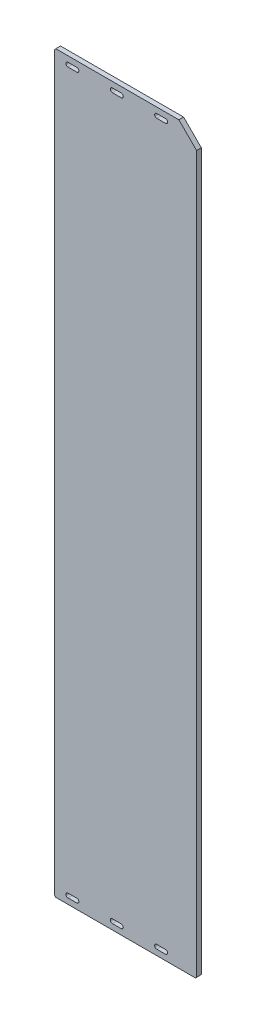
ISO-10303-21;
HEADER;
FILE_DESCRIPTION(('STEP AP214'),'2;1');
FILE_NAME('part.step','',(''),(''),'','','');
FILE_SCHEMA(('AUTOMOTIVE_DESIGN { 1 0 10303 214 1 1 1 1 }'));
ENDSEC;
DATA;
#1=APPLICATION_CONTEXT('core data for automotive mechanical design processes');
#2=APPLICATION_PROTOCOL_DEFINITION('international standard','automotive_design',2000,#1);
#3=PRODUCT_CONTEXT('',#1,'mechanical');
#4=PRODUCT('Part','Part','',(#3));
#5=PRODUCT_RELATED_PRODUCT_CATEGORY('part','',(#4));
#6=PRODUCT_DEFINITION_FORMATION('','',#4);
#7=PRODUCT_DEFINITION_CONTEXT('part definition',#1,'design');
#8=PRODUCT_DEFINITION('design','',#6,#7);
#9=PRODUCT_DEFINITION_SHAPE('','',#8);
#10=(LENGTH_UNIT() NAMED_UNIT(*) SI_UNIT(.MILLI.,.METRE.));
#11=(NAMED_UNIT(*) PLANE_ANGLE_UNIT() SI_UNIT($,.RADIAN.));
#12=(NAMED_UNIT(*) SI_UNIT($,.STERADIAN.) SOLID_ANGLE_UNIT());
#13=UNCERTAINTY_MEASURE_WITH_UNIT(LENGTH_MEASURE(1.E-05),#10,'distance_accuracy_value','');
#14=(GEOMETRIC_REPRESENTATION_CONTEXT(3) GLOBAL_UNCERTAINTY_ASSIGNED_CONTEXT((#13)) GLOBAL_UNIT_ASSIGNED_CONTEXT((#10,
#11,#12)) REPRESENTATION_CONTEXT('',''));
#15=CARTESIAN_POINT('',(0.,0.,0.));
#16=DIRECTION('',(0.,0.,1.));
#17=DIRECTION('',(1.,0.,0.));
#18=AXIS2_PLACEMENT_3D('',#15,#16,#17);
#19=CARTESIAN_POINT('',(120.,-621.,8.));
#20=DIRECTION('',(-1.,0.,0.));
#21=DIRECTION('',(0.,0.,1.));
#22=AXIS2_PLACEMENT_3D('',#19,#20,#21);
#23=PLANE('',#22);
#24=DIRECTION('',(0.,1.,0.));
#25=VECTOR('',#24,1.);
#26=CARTESIAN_POINT('',(120.,-621.,8.));
#27=LINE('',#26,#25);
#28=CARTESIAN_POINT('',(120.,-619.,8.));
#29=VERTEX_POINT('',#28);
#30=CARTESIAN_POINT('',(120.,591.,8.));
#31=VERTEX_POINT('',#30);
#32=EDGE_CURVE('E441',#29,#31,#27,.T.);
#33=ORIENTED_EDGE('',*,*,#32,.F.);
#34=DIRECTION('',(0.,0.,-1.));
#35=VECTOR('',#34,1.);
#36=CARTESIAN_POINT('',(120.,-619.,8.));
#37=LINE('',#36,#35);
#38=CARTESIAN_POINT('',(120.,-619.,0.));
#39=VERTEX_POINT('',#38);
#40=EDGE_CURVE('E473',#29,#39,#37,.T.);
#41=ORIENTED_EDGE('',*,*,#40,.T.);
#42=DIRECTION('',(0.,1.,0.));
#43=VECTOR('',#42,1.);
#44=CARTESIAN_POINT('',(120.,-621.,0.));
#45=LINE('',#44,#43);
#46=CARTESIAN_POINT('',(120.,591.,0.));
#47=VERTEX_POINT('',#46);
#48=EDGE_CURVE('E440',#39,#47,#45,.T.);
#49=ORIENTED_EDGE('',*,*,#48,.T.);
#50=DIRECTION('',(0.,0.,1.));
#51=VECTOR('',#50,1.);
#52=CARTESIAN_POINT('',(120.,591.,8.));
#53=LINE('',#52,#51);
#54=EDGE_CURVE('E468',#47,#31,#53,.T.);
#55=ORIENTED_EDGE('',*,*,#54,.T.);
#56=EDGE_LOOP('',(#33,#41,#49,#55));
#57=FACE_BOUND('',#56,.T.);
#58=ADVANCED_FACE('F34',(#57),#23,.F.);
#59=CARTESIAN_POINT('',(-120.,621.,8.));
#60=DIRECTION('',(0.,-1.,0.));
#61=DIRECTION('',(0.,0.,-1.));
#62=AXIS2_PLACEMENT_3D('',#59,#60,#61);
#63=PLANE('',#62);
#64=DIRECTION('',(-1.,0.,0.));
#65=VECTOR('',#64,1.);
#66=CARTESIAN_POINT('',(-120.,621.,0.));
#67=LINE('',#66,#65);
#68=CARTESIAN_POINT('',(89.9999999999998,621.,0.));
#69=VERTEX_POINT('',#68);
#70=CARTESIAN_POINT('',(-118.,621.,0.));
#71=VERTEX_POINT('',#70);
#72=EDGE_CURVE('E455',#69,#71,#67,.T.);
#73=ORIENTED_EDGE('',*,*,#72,.T.);
#74=DIRECTION('',(0.,0.,1.));
#75=VECTOR('',#74,1.);
#76=CARTESIAN_POINT('',(-118.,621.,8.));
#77=LINE('',#76,#75);
#78=CARTESIAN_POINT('',(-118.,621.,8.));
#79=VERTEX_POINT('',#78);
#80=EDGE_CURVE('E11',#71,#79,#77,.T.);
#81=ORIENTED_EDGE('',*,*,#80,.T.);
#82=DIRECTION('',(-1.,0.,0.));
#83=VECTOR('',#82,1.);
#84=CARTESIAN_POINT('',(-120.,621.,8.));
#85=LINE('',#84,#83);
#86=CARTESIAN_POINT('',(89.9999999999998,621.,8.));
#87=VERTEX_POINT('',#86);
#88=EDGE_CURVE('E443',#87,#79,#85,.T.);
#89=ORIENTED_EDGE('',*,*,#88,.F.);
#90=DIRECTION('',(0.,0.,-1.));
#91=VECTOR('',#90,1.);
#92=CARTESIAN_POINT('',(89.9999999999998,621.,8.));
#93=LINE('',#92,#91);
#94=EDGE_CURVE('E453',#87,#69,#93,.T.);
#95=ORIENTED_EDGE('',*,*,#94,.T.);
#96=EDGE_LOOP('',(#73,#81,#89,#95));
#97=FACE_BOUND('',#96,.T.);
#98=ADVANCED_FACE('F527',(#97),#63,.F.);
#99=CARTESIAN_POINT('',(-120.,-621.,8.));
#100=DIRECTION('',(1.,0.,0.));
#101=DIRECTION('',(0.,0.,-1.));
#102=AXIS2_PLACEMENT_3D('',#99,#100,#101);
#103=PLANE('',#102);
#104=DIRECTION('',(0.,-1.,0.));
#105=VECTOR('',#104,1.);
#106=CARTESIAN_POINT('',(-120.,-621.,0.));
#107=LINE('',#106,#105);
#108=CARTESIAN_POINT('',(-120.,619.,0.));
#109=VERTEX_POINT('',#108);
#110=CARTESIAN_POINT('',(-120.,-619.,0.));
#111=VERTEX_POINT('',#110);
#112=EDGE_CURVE('E458',#109,#111,#107,.T.);
#113=ORIENTED_EDGE('',*,*,#112,.T.);
#114=DIRECTION('',(0.,0.,1.));
#115=VECTOR('',#114,1.);
#116=CARTESIAN_POINT('',(-120.,-619.,8.));
#117=LINE('',#116,#115);
#118=CARTESIAN_POINT('',(-120.,-619.,8.));
#119=VERTEX_POINT('',#118);
#120=EDGE_CURVE('E42',#111,#119,#117,.T.);
#121=ORIENTED_EDGE('',*,*,#120,.T.);
#122=DIRECTION('',(0.,-1.,0.));
#123=VECTOR('',#122,1.);
#124=CARTESIAN_POINT('',(-120.,-621.,8.));
#125=LINE('',#124,#123);
#126=CARTESIAN_POINT('',(-120.,619.,8.));
#127=VERTEX_POINT('',#126);
#128=EDGE_CURVE('E447',#127,#119,#125,.T.);
#129=ORIENTED_EDGE('',*,*,#128,.F.);
#130=DIRECTION('',(0.,0.,-1.));
#131=VECTOR('',#130,1.);
#132=CARTESIAN_POINT('',(-120.,619.,8.));
#133=LINE('',#132,#131);
#134=EDGE_CURVE('E493',#127,#109,#133,.T.);
#135=ORIENTED_EDGE('',*,*,#134,.T.);
#136=EDGE_LOOP('',(#113,#121,#129,#135));
#137=FACE_BOUND('',#136,.T.);
#138=ADVANCED_FACE('F498',(#137),#103,.F.);
#139=CARTESIAN_POINT('',(-120.,-621.,8.));
#140=DIRECTION('',(0.,1.,0.));
#141=DIRECTION('',(0.,0.,1.));
#142=AXIS2_PLACEMENT_3D('',#139,#140,#141);
#143=PLANE('',#142);
#144=DIRECTION('',(1.,0.,0.));
#145=VECTOR('',#144,1.);
#146=CARTESIAN_POINT('',(-120.,-621.,0.));
#147=LINE('',#146,#145);
#148=CARTESIAN_POINT('',(-118.,-621.,0.));
#149=VERTEX_POINT('',#148);
#150=CARTESIAN_POINT('',(118.,-621.,0.));
#151=VERTEX_POINT('',#150);
#152=EDGE_CURVE('E444',#149,#151,#147,.T.);
#153=ORIENTED_EDGE('',*,*,#152,.T.);
#154=DIRECTION('',(0.,0.,1.));
#155=VECTOR('',#154,1.);
#156=CARTESIAN_POINT('',(118.,-621.,8.));
#157=LINE('',#156,#155);
#158=CARTESIAN_POINT('',(118.,-621.,8.));
#159=VERTEX_POINT('',#158);
#160=EDGE_CURVE('E485',#151,#159,#157,.T.);
#161=ORIENTED_EDGE('',*,*,#160,.T.);
#162=DIRECTION('',(1.,0.,0.));
#163=VECTOR('',#162,1.);
#164=CARTESIAN_POINT('',(-120.,-621.,8.));
#165=LINE('',#164,#163);
#166=CARTESIAN_POINT('',(-118.,-621.,8.));
#167=VERTEX_POINT('',#166);
#168=EDGE_CURVE('E450',#167,#159,#165,.T.);
#169=ORIENTED_EDGE('',*,*,#168,.F.);
#170=DIRECTION('',(0.,0.,-1.));
#171=VECTOR('',#170,1.);
#172=CARTESIAN_POINT('',(-118.,-621.,8.));
#173=LINE('',#172,#171);
#174=EDGE_CURVE('E482',#167,#149,#173,.T.);
#175=ORIENTED_EDGE('',*,*,#174,.T.);
#176=EDGE_LOOP('',(#153,#161,#169,#175));
#177=FACE_BOUND('',#176,.T.);
#178=ADVANCED_FACE('F511',(#177),#143,.F.);
#179=CARTESIAN_POINT('',(0.,0.,8.));
#180=DIRECTION('',(0.,0.,-1.));
#181=DIRECTION('',(-1.,0.,0.));
#182=AXIS2_PLACEMENT_3D('',#179,#180,#181);
#183=PLANE('',#182);
#184=DIRECTION('',(1.,0.,0.));
#185=VECTOR('',#184,1.);
#186=CARTESIAN_POINT('',(0.,611.500000000123,8.));
#187=LINE('',#186,#185);
#188=CARTESIAN_POINT('',(-22.5000000000772,611.500000000123,8.));
#189=VERTEX_POINT('',#188);
#190=CARTESIAN_POINT('',(-7.5000000000772,611.500000000123,8.));
#191=VERTEX_POINT('',#190);
#192=EDGE_CURVE('E402',#189,#191,#187,.T.);
#193=ORIENTED_EDGE('',*,*,#192,.T.);
#194=CARTESIAN_POINT('',(-7.5000000000772,608.000000000123,8.));
#195=DIRECTION('',(0.,0.,-1.));
#196=DIRECTION('',(-1.,0.,0.));
#197=AXIS2_PLACEMENT_3D('',#194,#195,#196);
#198=CIRCLE('',#197,3.50000000000006);
#199=CARTESIAN_POINT('',(-7.5000000000772,604.500000000123,8.));
#200=VERTEX_POINT('',#199);
#201=EDGE_CURVE('E405',#191,#200,#198,.T.);
#202=ORIENTED_EDGE('',*,*,#201,.T.);
#203=DIRECTION('',(-1.,0.,0.));
#204=VECTOR('',#203,1.);
#205=CARTESIAN_POINT('',(0.,604.500000000123,8.));
#206=LINE('',#205,#204);
#207=CARTESIAN_POINT('',(-22.5000000000772,604.500000000123,8.));
#208=VERTEX_POINT('',#207);
#209=EDGE_CURVE('E399',#200,#208,#206,.T.);
#210=ORIENTED_EDGE('',*,*,#209,.T.);
#211=CARTESIAN_POINT('',(-22.5000000000772,608.000000000123,8.));
#212=DIRECTION('',(0.,0.,-1.));
#213=DIRECTION('',(-1.,0.,0.));
#214=AXIS2_PLACEMENT_3D('',#211,#212,#213);
#215=CIRCLE('',#214,3.50000000000006);
#216=EDGE_CURVE('E247',#208,#189,#215,.T.);
#217=ORIENTED_EDGE('',*,*,#216,.T.);
#218=EDGE_LOOP('',(#193,#202,#210,#217));
#219=FACE_BOUND('',#218,.T.);
#220=DIRECTION('',(1.,0.,0.));
#221=VECTOR('',#220,1.);
#222=CARTESIAN_POINT('',(0.,611.500000000123,8.));
#223=LINE('',#222,#221);
#224=CARTESIAN_POINT('',(-97.5000000000772,611.500000000123,8.));
#225=VERTEX_POINT('',#224);
#226=CARTESIAN_POINT('',(-82.5000000000772,611.500000000123,8.));
#227=VERTEX_POINT('',#226);
#228=EDGE_CURVE('E393',#225,#227,#223,.T.);
#229=ORIENTED_EDGE('',*,*,#228,.T.);
#230=CARTESIAN_POINT('',(-82.5000000000772,608.000000000123,8.));
#231=DIRECTION('',(0.,0.,-1.));
#232=DIRECTION('',(-1.,0.,0.));
#233=AXIS2_PLACEMENT_3D('',#230,#231,#232);
#234=CIRCLE('',#233,3.50000000000006);
#235=CARTESIAN_POINT('',(-82.5000000000772,604.500000000123,8.));
#236=VERTEX_POINT('',#235);
#237=EDGE_CURVE('E396',#227,#236,#234,.T.);
#238=ORIENTED_EDGE('',*,*,#237,.T.);
#239=DIRECTION('',(-1.,0.,0.));
#240=VECTOR('',#239,1.);
#241=CARTESIAN_POINT('',(0.,604.500000000123,8.));
#242=LINE('',#241,#240);
#243=CARTESIAN_POINT('',(-97.5000000000772,604.500000000123,8.));
#244=VERTEX_POINT('',#243);
#245=EDGE_CURVE('E387',#236,#244,#242,.T.);
#246=ORIENTED_EDGE('',*,*,#245,.T.);
#247=CARTESIAN_POINT('',(-97.5000000000772,608.000000000123,8.));
#248=DIRECTION('',(0.,0.,-1.));
#249=DIRECTION('',(-1.,0.,0.));
#250=AXIS2_PLACEMENT_3D('',#247,#248,#249);
#251=CIRCLE('',#250,3.50000000000006);
#252=EDGE_CURVE('E390',#244,#225,#251,.T.);
#253=ORIENTED_EDGE('',*,*,#252,.T.);
#254=EDGE_LOOP('',(#229,#238,#246,#253));
#255=FACE_BOUND('',#254,.T.);
#256=DIRECTION('',(1.,0.,0.));
#257=VECTOR('',#256,1.);
#258=CARTESIAN_POINT('',(0.,-604.500000000123,8.));
#259=LINE('',#258,#257);
#260=CARTESIAN_POINT('',(52.4999999999228,-604.500000000123,8.));
#261=VERTEX_POINT('',#260);
#262=CARTESIAN_POINT('',(67.4999999999227,-604.500000000123,8.));
#263=VERTEX_POINT('',#262);
#264=EDGE_CURVE('E381',#261,#263,#259,.T.);
#265=ORIENTED_EDGE('',*,*,#264,.T.);
#266=CARTESIAN_POINT('',(67.4999999999227,-608.000000000123,8.));
#267=DIRECTION('',(0.,0.,-1.));
#268=DIRECTION('',(-1.,0.,0.));
#269=AXIS2_PLACEMENT_3D('',#266,#267,#268);
#270=CIRCLE('',#269,3.50000000000006);
#271=CARTESIAN_POINT('',(67.4999999999227,-611.500000000123,8.));
#272=VERTEX_POINT('',#271);
#273=EDGE_CURVE('E384',#263,#272,#270,.T.);
#274=ORIENTED_EDGE('',*,*,#273,.T.);
#275=DIRECTION('',(-1.,0.,0.));
#276=VECTOR('',#275,1.);
#277=CARTESIAN_POINT('',(0.,-611.500000000123,8.));
#278=LINE('',#277,#276);
#279=CARTESIAN_POINT('',(52.4999999999228,-611.500000000123,8.));
#280=VERTEX_POINT('',#279);
#281=EDGE_CURVE('E375',#272,#280,#278,.T.);
#282=ORIENTED_EDGE('',*,*,#281,.T.);
#283=CARTESIAN_POINT('',(52.4999999999228,-608.000000000123,8.));
#284=DIRECTION('',(0.,0.,-1.));
#285=DIRECTION('',(-1.,0.,0.));
#286=AXIS2_PLACEMENT_3D('',#283,#284,#285);
#287=CIRCLE('',#286,3.50000000000006);
#288=EDGE_CURVE('E378',#280,#261,#287,.T.);
#289=ORIENTED_EDGE('',*,*,#288,.T.);
#290=EDGE_LOOP('',(#265,#274,#282,#289));
#291=FACE_BOUND('',#290,.T.);
#292=DIRECTION('',(1.,0.,0.));
#293=VECTOR('',#292,1.);
#294=CARTESIAN_POINT('',(0.,-604.500000000123,8.));
#295=LINE('',#294,#293);
#296=CARTESIAN_POINT('',(-22.5000000000772,-604.500000000123,8.));
#297=VERTEX_POINT('',#296);
#298=CARTESIAN_POINT('',(-7.5000000000772,-604.500000000123,8.));
#299=VERTEX_POINT('',#298);
#300=EDGE_CURVE('E369',#297,#299,#295,.T.);
#301=ORIENTED_EDGE('',*,*,#300,.T.);
#302=CARTESIAN_POINT('',(-7.5000000000772,-608.000000000123,8.));
#303=DIRECTION('',(0.,0.,-1.));
#304=DIRECTION('',(-1.,0.,0.));
#305=AXIS2_PLACEMENT_3D('',#302,#303,#304);
#306=CIRCLE('',#305,3.50000000000006);
#307=CARTESIAN_POINT('',(-7.5000000000772,-611.500000000123,8.));
#308=VERTEX_POINT('',#307);
#309=EDGE_CURVE('E372',#299,#308,#306,.T.);
#310=ORIENTED_EDGE('',*,*,#309,.T.);
#311=DIRECTION('',(-1.,0.,0.));
#312=VECTOR('',#311,1.);
#313=CARTESIAN_POINT('',(0.,-611.500000000123,8.));
#314=LINE('',#313,#312);
#315=CARTESIAN_POINT('',(-22.5000000000772,-611.500000000123,8.));
#316=VERTEX_POINT('',#315);
#317=EDGE_CURVE('E363',#308,#316,#314,.T.);
#318=ORIENTED_EDGE('',*,*,#317,.T.);
#319=CARTESIAN_POINT('',(-22.5000000000772,-608.000000000123,8.));
#320=DIRECTION('',(0.,0.,-1.));
#321=DIRECTION('',(-1.,0.,0.));
#322=AXIS2_PLACEMENT_3D('',#319,#320,#321);
#323=CIRCLE('',#322,3.50000000000006);
#324=EDGE_CURVE('E366',#316,#297,#323,.T.);
#325=ORIENTED_EDGE('',*,*,#324,.T.);
#326=EDGE_LOOP('',(#301,#310,#318,#325));
#327=FACE_BOUND('',#326,.T.);
#328=DIRECTION('',(1.,0.,0.));
#329=VECTOR('',#328,1.);
#330=CARTESIAN_POINT('',(0.,-604.500000000123,8.));
#331=LINE('',#330,#329);
#332=CARTESIAN_POINT('',(-97.5000000000771,-604.500000000123,8.));
#333=VERTEX_POINT('',#332);
#334=CARTESIAN_POINT('',(-82.5000000000771,-604.500000000123,8.));
#335=VERTEX_POINT('',#334);
#336=EDGE_CURVE('E357',#333,#335,#331,.T.);
#337=ORIENTED_EDGE('',*,*,#336,.T.);
#338=CARTESIAN_POINT('',(-82.5000000000771,-608.000000000123,8.));
#339=DIRECTION('',(0.,0.,-1.));
#340=DIRECTION('',(-1.,0.,0.));
#341=AXIS2_PLACEMENT_3D('',#338,#339,#340);
#342=CIRCLE('',#341,3.50000000000006);
#343=CARTESIAN_POINT('',(-82.5000000000771,-611.500000000123,8.));
#344=VERTEX_POINT('',#343);
#345=EDGE_CURVE('E360',#335,#344,#342,.T.);
#346=ORIENTED_EDGE('',*,*,#345,.T.);
#347=DIRECTION('',(-1.,0.,0.));
#348=VECTOR('',#347,1.);
#349=CARTESIAN_POINT('',(0.,-611.500000000123,8.));
#350=LINE('',#349,#348);
#351=CARTESIAN_POINT('',(-97.5000000000771,-611.500000000123,8.));
#352=VERTEX_POINT('',#351);
#353=EDGE_CURVE('E271',#344,#352,#350,.T.);
#354=ORIENTED_EDGE('',*,*,#353,.T.);
#355=CARTESIAN_POINT('',(-97.5000000000771,-608.000000000123,8.));
#356=DIRECTION('',(0.,0.,-1.));
#357=DIRECTION('',(-1.,0.,0.));
#358=AXIS2_PLACEMENT_3D('',#355,#356,#357);
#359=CIRCLE('',#358,3.50000000000006);
#360=EDGE_CURVE('E354',#352,#333,#359,.T.);
#361=ORIENTED_EDGE('',*,*,#360,.T.);
#362=EDGE_LOOP('',(#337,#346,#354,#361));
#363=FACE_BOUND('',#362,.T.);
#364=DIRECTION('',(1.,0.,0.));
#365=VECTOR('',#364,1.);
#366=CARTESIAN_POINT('',(0.,611.500000000123,8.));
#367=LINE('',#366,#365);
#368=CARTESIAN_POINT('',(52.4999999999228,611.500000000123,8.));
#369=VERTEX_POINT('',#368);
#370=CARTESIAN_POINT('',(67.4999999999228,611.500000000123,8.));
#371=VERTEX_POINT('',#370);
#372=EDGE_CURVE('E434',#369,#371,#367,.T.);
#373=ORIENTED_EDGE('',*,*,#372,.T.);
#374=CARTESIAN_POINT('',(67.4999999999228,608.000000000123,8.));
#375=DIRECTION('',(0.,0.,-1.));
#376=DIRECTION('',(-1.,0.,0.));
#377=AXIS2_PLACEMENT_3D('',#374,#375,#376);
#378=CIRCLE('',#377,3.50000000000006);
#379=CARTESIAN_POINT('',(67.4999999999228,604.500000000123,8.));
#380=VERTEX_POINT('',#379);
#381=EDGE_CURVE('E437',#371,#380,#378,.T.);
#382=ORIENTED_EDGE('',*,*,#381,.T.);
#383=DIRECTION('',(-1.,0.,0.));
#384=VECTOR('',#383,1.);
#385=CARTESIAN_POINT('',(0.,604.500000000123,8.));
#386=LINE('',#385,#384);
#387=CARTESIAN_POINT('',(52.4999999999228,604.500000000123,8.));
#388=VERTEX_POINT('',#387);
#389=EDGE_CURVE('E422',#380,#388,#386,.T.);
#390=ORIENTED_EDGE('',*,*,#389,.T.);
#391=CARTESIAN_POINT('',(52.4999999999228,608.000000000123,8.));
#392=DIRECTION('',(0.,0.,-1.));
#393=DIRECTION('',(-1.,0.,0.));
#394=AXIS2_PLACEMENT_3D('',#391,#392,#393);
#395=CIRCLE('',#394,3.50000000000006);
#396=EDGE_CURVE('E431',#388,#369,#395,.T.);
#397=ORIENTED_EDGE('',*,*,#396,.T.);
#398=EDGE_LOOP('',(#373,#382,#390,#397));
#399=FACE_BOUND('',#398,.T.);
#400=ORIENTED_EDGE('',*,*,#168,.T.);
#401=DIRECTION('',(-0.707106781186567,-0.707106781186528,0.));
#402=VECTOR('',#401,1.);
#403=CARTESIAN_POINT('',(120.,-619.,8.));
#404=LINE('',#403,#402);
#405=EDGE_CURVE('E491',#159,#29,#404,.F.);
#406=ORIENTED_EDGE('',*,*,#405,.T.);
#407=ORIENTED_EDGE('',*,*,#32,.T.);
#408=DIRECTION('',(0.707106781186546,-0.707106781186549,0.));
#409=VECTOR('',#408,1.);
#410=CARTESIAN_POINT('',(89.9999999999998,621.,8.));
#411=LINE('',#410,#409);
#412=EDGE_CURVE('E471',#31,#87,#411,.F.);
#413=ORIENTED_EDGE('',*,*,#412,.T.);
#414=ORIENTED_EDGE('',*,*,#88,.T.);
#415=DIRECTION('',(0.707106781186587,0.707106781186508,0.));
#416=VECTOR('',#415,1.);
#417=CARTESIAN_POINT('',(-120.,619.,8.));
#418=LINE('',#417,#416);
#419=EDGE_CURVE('E487',#79,#127,#418,.F.);
#420=ORIENTED_EDGE('',*,*,#419,.T.);
#421=ORIENTED_EDGE('',*,*,#128,.T.);
#422=DIRECTION('',(-0.707106781186548,0.707106781186548,0.));
#423=VECTOR('',#422,1.);
#424=CARTESIAN_POINT('',(-118.,-621.,8.));
#425=LINE('',#424,#423);
#426=EDGE_CURVE('E489',#119,#167,#425,.F.);
#427=ORIENTED_EDGE('',*,*,#426,.T.);
#428=EDGE_LOOP('',(#400,#406,#407,#413,#414,#420,#421,#427));
#429=FACE_BOUND('',#428,.T.);
#430=ADVANCED_FACE('F504',(#219,#255,#291,#327,#363,#399,#429),#183,.F.);
#431=CARTESIAN_POINT('',(0.,0.,0.));
#432=DIRECTION('',(0.,0.,-1.));
#433=DIRECTION('',(-1.,0.,0.));
#434=AXIS2_PLACEMENT_3D('',#431,#432,#433);
#435=PLANE('',#434);
#436=CARTESIAN_POINT('',(-7.5000000000772,608.000000000123,0.));
#437=DIRECTION('',(0.,0.,-1.));
#438=DIRECTION('',(-1.,0.,0.));
#439=AXIS2_PLACEMENT_3D('',#436,#437,#438);
#440=CIRCLE('',#439,3.50000000000006);
#441=CARTESIAN_POINT('',(-7.5000000000772,611.500000000123,0.));
#442=VERTEX_POINT('',#441);
#443=CARTESIAN_POINT('',(-7.5000000000772,604.500000000123,0.));
#444=VERTEX_POINT('',#443);
#445=EDGE_CURVE('E259',#442,#444,#440,.T.);
#446=ORIENTED_EDGE('',*,*,#445,.F.);
#447=DIRECTION('',(1.,0.,0.));
#448=VECTOR('',#447,1.);
#449=CARTESIAN_POINT('',(-7.5000000000772,611.500000000123,0.));
#450=LINE('',#449,#448);
#451=CARTESIAN_POINT('',(-22.5000000000772,611.500000000123,0.));
#452=VERTEX_POINT('',#451);
#453=EDGE_CURVE('E264',#452,#442,#450,.T.);
#454=ORIENTED_EDGE('',*,*,#453,.F.);
#455=CARTESIAN_POINT('',(-22.5000000000772,608.000000000123,0.));
#456=DIRECTION('',(0.,0.,-1.));
#457=DIRECTION('',(-1.,0.,0.));
#458=AXIS2_PLACEMENT_3D('',#455,#456,#457);
#459=CIRCLE('',#458,3.50000000000006);
#460=CARTESIAN_POINT('',(-22.5000000000772,604.500000000123,0.));
#461=VERTEX_POINT('',#460);
#462=EDGE_CURVE('E244',#461,#452,#459,.T.);
#463=ORIENTED_EDGE('',*,*,#462,.F.);
#464=DIRECTION('',(-1.,0.,0.));
#465=VECTOR('',#464,1.);
#466=CARTESIAN_POINT('',(-7.5000000000772,604.500000000123,0.));
#467=LINE('',#466,#465);
#468=EDGE_CURVE('E254',#444,#461,#467,.T.);
#469=ORIENTED_EDGE('',*,*,#468,.F.);
#470=EDGE_LOOP('',(#446,#454,#463,#469));
#471=FACE_BOUND('',#470,.T.);
#472=CARTESIAN_POINT('',(-82.5000000000772,608.000000000123,0.));
#473=DIRECTION('',(0.,0.,-1.));
#474=DIRECTION('',(-1.,0.,0.));
#475=AXIS2_PLACEMENT_3D('',#472,#473,#474);
#476=CIRCLE('',#475,3.50000000000006);
#477=CARTESIAN_POINT('',(-82.5000000000772,611.500000000123,0.));
#478=VERTEX_POINT('',#477);
#479=CARTESIAN_POINT('',(-82.5000000000772,604.500000000123,0.));
#480=VERTEX_POINT('',#479);
#481=EDGE_CURVE('E274',#478,#480,#476,.T.);
#482=ORIENTED_EDGE('',*,*,#481,.F.);
#483=DIRECTION('',(1.,0.,0.));
#484=VECTOR('',#483,1.);
#485=CARTESIAN_POINT('',(-82.5000000000772,611.500000000123,0.));
#486=LINE('',#485,#484);
#487=CARTESIAN_POINT('',(-97.5000000000772,611.500000000123,0.));
#488=VERTEX_POINT('',#487);
#489=EDGE_CURVE('E282',#488,#478,#486,.T.);
#490=ORIENTED_EDGE('',*,*,#489,.F.);
#491=CARTESIAN_POINT('',(-97.5000000000772,608.000000000123,0.));
#492=DIRECTION('',(0.,0.,-1.));
#493=DIRECTION('',(-1.,0.,0.));
#494=AXIS2_PLACEMENT_3D('',#491,#492,#493);
#495=CIRCLE('',#494,3.50000000000006);
#496=CARTESIAN_POINT('',(-97.5000000000772,604.500000000123,0.));
#497=VERTEX_POINT('',#496);
#498=EDGE_CURVE('E279',#497,#488,#495,.T.);
#499=ORIENTED_EDGE('',*,*,#498,.F.);
#500=DIRECTION('',(-1.,0.,0.));
#501=VECTOR('',#500,1.);
#502=CARTESIAN_POINT('',(-82.5000000000772,604.500000000123,0.));
#503=LINE('',#502,#501);
#504=EDGE_CURVE('E276',#480,#497,#503,.T.);
#505=ORIENTED_EDGE('',*,*,#504,.F.);
#506=EDGE_LOOP('',(#482,#490,#499,#505));
#507=FACE_BOUND('',#506,.T.);
#508=CARTESIAN_POINT('',(67.4999999999227,-608.000000000123,0.));
#509=DIRECTION('',(0.,0.,-1.));
#510=DIRECTION('',(1.,0.,0.));
#511=AXIS2_PLACEMENT_3D('',#508,#509,#510);
#512=CIRCLE('',#511,3.50000000000006);
#513=CARTESIAN_POINT('',(67.4999999999227,-604.500000000123,0.));
#514=VERTEX_POINT('',#513);
#515=CARTESIAN_POINT('',(67.4999999999227,-611.500000000123,0.));
#516=VERTEX_POINT('',#515);
#517=EDGE_CURVE('E293',#514,#516,#512,.T.);
#518=ORIENTED_EDGE('',*,*,#517,.F.);
#519=DIRECTION('',(1.,0.,0.));
#520=VECTOR('',#519,1.);
#521=CARTESIAN_POINT('',(67.4999999999227,-604.500000000123,0.));
#522=LINE('',#521,#520);
#523=CARTESIAN_POINT('',(52.4999999999228,-604.500000000123,0.));
#524=VERTEX_POINT('',#523);
#525=EDGE_CURVE('E302',#524,#514,#522,.T.);
#526=ORIENTED_EDGE('',*,*,#525,.F.);
#527=CARTESIAN_POINT('',(52.4999999999228,-608.000000000123,0.));
#528=DIRECTION('',(0.,0.,-1.));
#529=DIRECTION('',(1.,0.,0.));
#530=AXIS2_PLACEMENT_3D('',#527,#528,#529);
#531=CIRCLE('',#530,3.50000000000006);
#532=CARTESIAN_POINT('',(52.4999999999228,-611.500000000123,0.));
#533=VERTEX_POINT('',#532);
#534=EDGE_CURVE('E299',#533,#524,#531,.T.);
#535=ORIENTED_EDGE('',*,*,#534,.F.);
#536=DIRECTION('',(-1.,0.,0.));
#537=VECTOR('',#536,1.);
#538=CARTESIAN_POINT('',(67.4999999999227,-611.500000000123,0.));
#539=LINE('',#538,#537);
#540=EDGE_CURVE('E295',#516,#533,#539,.T.);
#541=ORIENTED_EDGE('',*,*,#540,.F.);
#542=EDGE_LOOP('',(#518,#526,#535,#541));
#543=FACE_BOUND('',#542,.T.);
#544=CARTESIAN_POINT('',(-7.5000000000772,-608.000000000123,0.));
#545=DIRECTION('',(0.,0.,-1.));
#546=DIRECTION('',(1.,0.,0.));
#547=AXIS2_PLACEMENT_3D('',#544,#545,#546);
#548=CIRCLE('',#547,3.50000000000006);
#549=CARTESIAN_POINT('',(-7.5000000000772,-604.500000000123,0.));
#550=VERTEX_POINT('',#549);
#551=CARTESIAN_POINT('',(-7.5000000000772,-611.500000000123,0.));
#552=VERTEX_POINT('',#551);
#553=EDGE_CURVE('E313',#550,#552,#548,.T.);
#554=ORIENTED_EDGE('',*,*,#553,.F.);
#555=DIRECTION('',(1.,0.,0.));
#556=VECTOR('',#555,1.);
#557=CARTESIAN_POINT('',(-7.5000000000772,-604.500000000123,0.));
#558=LINE('',#557,#556);
#559=CARTESIAN_POINT('',(-22.5000000000772,-604.500000000123,0.));
#560=VERTEX_POINT('',#559);
#561=EDGE_CURVE('E322',#560,#550,#558,.T.);
#562=ORIENTED_EDGE('',*,*,#561,.F.);
#563=CARTESIAN_POINT('',(-22.5000000000772,-608.000000000123,0.));
#564=DIRECTION('',(0.,0.,-1.));
#565=DIRECTION('',(1.,0.,0.));
#566=AXIS2_PLACEMENT_3D('',#563,#564,#565);
#567=CIRCLE('',#566,3.50000000000006);
#568=CARTESIAN_POINT('',(-22.5000000000772,-611.500000000123,0.));
#569=VERTEX_POINT('',#568);
#570=EDGE_CURVE('E319',#569,#560,#567,.T.);
#571=ORIENTED_EDGE('',*,*,#570,.F.);
#572=DIRECTION('',(-1.,0.,0.));
#573=VECTOR('',#572,1.);
#574=CARTESIAN_POINT('',(-7.5000000000772,-611.500000000123,0.));
#575=LINE('',#574,#573);
#576=EDGE_CURVE('E315',#552,#569,#575,.T.);
#577=ORIENTED_EDGE('',*,*,#576,.F.);
#578=EDGE_LOOP('',(#554,#562,#571,#577));
#579=FACE_BOUND('',#578,.T.);
#580=CARTESIAN_POINT('',(-82.5000000000771,-608.000000000123,0.));
#581=DIRECTION('',(0.,0.,-1.));
#582=DIRECTION('',(1.,0.,0.));
#583=AXIS2_PLACEMENT_3D('',#580,#581,#582);
#584=CIRCLE('',#583,3.50000000000006);
#585=CARTESIAN_POINT('',(-82.5000000000771,-604.500000000123,0.));
#586=VERTEX_POINT('',#585);
#587=CARTESIAN_POINT('',(-82.5000000000771,-611.500000000123,0.));
#588=VERTEX_POINT('',#587);
#589=EDGE_CURVE('E333',#586,#588,#584,.T.);
#590=ORIENTED_EDGE('',*,*,#589,.F.);
#591=DIRECTION('',(1.,0.,0.));
#592=VECTOR('',#591,1.);
#593=CARTESIAN_POINT('',(-82.5000000000771,-604.500000000123,0.));
#594=LINE('',#593,#592);
#595=CARTESIAN_POINT('',(-97.5000000000771,-604.500000000123,0.));
#596=VERTEX_POINT('',#595);
#597=EDGE_CURVE('E341',#596,#586,#594,.T.);
#598=ORIENTED_EDGE('',*,*,#597,.F.);
#599=CARTESIAN_POINT('',(-97.5000000000771,-608.000000000123,0.));
#600=DIRECTION('',(0.,0.,-1.));
#601=DIRECTION('',(1.,0.,0.));
#602=AXIS2_PLACEMENT_3D('',#599,#600,#601);
#603=CIRCLE('',#602,3.50000000000006);
#604=CARTESIAN_POINT('',(-97.5000000000771,-611.500000000123,0.));
#605=VERTEX_POINT('',#604);
#606=EDGE_CURVE('E338',#605,#596,#603,.T.);
#607=ORIENTED_EDGE('',*,*,#606,.F.);
#608=DIRECTION('',(-1.,0.,0.));
#609=VECTOR('',#608,1.);
#610=CARTESIAN_POINT('',(-82.5000000000771,-611.500000000123,0.));
#611=LINE('',#610,#609);
#612=EDGE_CURVE('E335',#588,#605,#611,.T.);
#613=ORIENTED_EDGE('',*,*,#612,.F.);
#614=EDGE_LOOP('',(#590,#598,#607,#613));
#615=FACE_BOUND('',#614,.T.);
#616=CARTESIAN_POINT('',(67.4999999999228,608.000000000123,0.));
#617=DIRECTION('',(0.,0.,-1.));
#618=DIRECTION('',(-1.,0.,0.));
#619=AXIS2_PLACEMENT_3D('',#616,#617,#618);
#620=CIRCLE('',#619,3.50000000000006);
#621=CARTESIAN_POINT('',(67.4999999999228,611.500000000123,0.));
#622=VERTEX_POINT('',#621);
#623=CARTESIAN_POINT('',(67.4999999999228,604.500000000123,0.));
#624=VERTEX_POINT('',#623);
#625=EDGE_CURVE('E408',#622,#624,#620,.T.);
#626=ORIENTED_EDGE('',*,*,#625,.F.);
#627=DIRECTION('',(1.,0.,0.));
#628=VECTOR('',#627,1.);
#629=CARTESIAN_POINT('',(67.4999999999228,611.500000000123,0.));
#630=LINE('',#629,#628);
#631=CARTESIAN_POINT('',(52.4999999999228,611.500000000123,0.));
#632=VERTEX_POINT('',#631);
#633=EDGE_CURVE('E416',#632,#622,#630,.T.);
#634=ORIENTED_EDGE('',*,*,#633,.F.);
#635=CARTESIAN_POINT('',(52.4999999999228,608.000000000123,0.));
#636=DIRECTION('',(0.,0.,-1.));
#637=DIRECTION('',(-1.,0.,0.));
#638=AXIS2_PLACEMENT_3D('',#635,#636,#637);
#639=CIRCLE('',#638,3.50000000000006);
#640=CARTESIAN_POINT('',(52.4999999999228,604.500000000123,0.));
#641=VERTEX_POINT('',#640);
#642=EDGE_CURVE('E413',#641,#632,#639,.T.);
#643=ORIENTED_EDGE('',*,*,#642,.F.);
#644=DIRECTION('',(-1.,0.,0.));
#645=VECTOR('',#644,1.);
#646=CARTESIAN_POINT('',(67.4999999999228,604.500000000123,0.));
#647=LINE('',#646,#645);
#648=EDGE_CURVE('E410',#624,#641,#647,.T.);
#649=ORIENTED_EDGE('',*,*,#648,.F.);
#650=EDGE_LOOP('',(#626,#634,#643,#649));
#651=FACE_BOUND('',#650,.T.);
#652=ORIENTED_EDGE('',*,*,#48,.F.);
#653=DIRECTION('',(0.707106781186567,0.707106781186528,0.));
#654=VECTOR('',#653,1.);
#655=CARTESIAN_POINT('',(369.499999999997,-369.500000000017,0.));
#656=LINE('',#655,#654);
#657=EDGE_CURVE('E480',#39,#151,#656,.F.);
#658=ORIENTED_EDGE('',*,*,#657,.T.);
#659=ORIENTED_EDGE('',*,*,#152,.F.);
#660=DIRECTION('',(0.707106781186548,-0.707106781186548,0.));
#661=VECTOR('',#660,1.);
#662=CARTESIAN_POINT('',(-369.5,-369.5,0.));
#663=LINE('',#662,#661);
#664=EDGE_CURVE('E478',#149,#111,#663,.F.);
#665=ORIENTED_EDGE('',*,*,#664,.T.);
#666=ORIENTED_EDGE('',*,*,#112,.F.);
#667=DIRECTION('',(-0.707106781186587,-0.707106781186508,0.));
#668=VECTOR('',#667,1.);
#669=CARTESIAN_POINT('',(-369.499999999993,369.500000000035,0.));
#670=LINE('',#669,#668);
#671=EDGE_CURVE('E476',#109,#71,#670,.F.);
#672=ORIENTED_EDGE('',*,*,#671,.T.);
#673=ORIENTED_EDGE('',*,*,#72,.F.);
#674=DIRECTION('',(-0.707106781186546,0.707106781186549,0.));
#675=VECTOR('',#674,1.);
#676=CARTESIAN_POINT('',(355.5,355.499999999999,0.));
#677=LINE('',#676,#675);
#678=EDGE_CURVE('E465',#69,#47,#677,.F.);
#679=ORIENTED_EDGE('',*,*,#678,.T.);
#680=EDGE_LOOP('',(#652,#658,#659,#665,#666,#672,#673,#679));
#681=FACE_BOUND('',#680,.T.);
#682=ADVANCED_FACE('F261',(#471,#507,#543,#579,#615,#651,#681),#435,.T.);
#683=CARTESIAN_POINT('',(89.9999999999998,621.,8.));
#684=DIRECTION('',(-0.707106781186549,-0.707106781186546,0.));
#685=DIRECTION('',(0.,0.,-1.));
#686=AXIS2_PLACEMENT_3D('',#683,#684,#685);
#687=PLANE('',#686);
#688=ORIENTED_EDGE('',*,*,#412,.F.);
#689=ORIENTED_EDGE('',*,*,#54,.F.);
#690=ORIENTED_EDGE('',*,*,#678,.F.);
#691=ORIENTED_EDGE('',*,*,#94,.F.);
#692=EDGE_LOOP('',(#688,#689,#690,#691));
#693=FACE_BOUND('',#692,.T.);
#694=ADVANCED_FACE('F530',(#693),#687,.F.);
#695=CARTESIAN_POINT('',(120.,-619.,8.));
#696=DIRECTION('',(-0.707106781186528,0.707106781186567,0.));
#697=DIRECTION('',(0.,0.,-1.));
#698=AXIS2_PLACEMENT_3D('',#695,#696,#697);
#699=PLANE('',#698);
#700=ORIENTED_EDGE('',*,*,#405,.F.);
#701=ORIENTED_EDGE('',*,*,#160,.F.);
#702=ORIENTED_EDGE('',*,*,#657,.F.);
#703=ORIENTED_EDGE('',*,*,#40,.F.);
#704=EDGE_LOOP('',(#700,#701,#702,#703));
#705=FACE_BOUND('',#704,.T.);
#706=ADVANCED_FACE('F518',(#705),#699,.F.);
#707=CARTESIAN_POINT('',(-118.,-621.,8.));
#708=DIRECTION('',(0.707106781186547,0.707106781186547,0.));
#709=DIRECTION('',(0.,0.,-1.));
#710=AXIS2_PLACEMENT_3D('',#707,#708,#709);
#711=PLANE('',#710);
#712=ORIENTED_EDGE('',*,*,#426,.F.);
#713=ORIENTED_EDGE('',*,*,#120,.F.);
#714=ORIENTED_EDGE('',*,*,#664,.F.);
#715=ORIENTED_EDGE('',*,*,#174,.F.);
#716=EDGE_LOOP('',(#712,#713,#714,#715));
#717=FACE_BOUND('',#716,.T.);
#718=ADVANCED_FACE('F508',(#717),#711,.F.);
#719=CARTESIAN_POINT('',(-120.,619.,8.));
#720=DIRECTION('',(0.707106781186508,-0.707106781186587,0.));
#721=DIRECTION('',(0.,0.,-1.));
#722=AXIS2_PLACEMENT_3D('',#719,#720,#721);
#723=PLANE('',#722);
#724=ORIENTED_EDGE('',*,*,#419,.F.);
#725=ORIENTED_EDGE('',*,*,#80,.F.);
#726=ORIENTED_EDGE('',*,*,#671,.F.);
#727=ORIENTED_EDGE('',*,*,#134,.F.);
#728=EDGE_LOOP('',(#724,#725,#726,#727));
#729=FACE_BOUND('',#728,.T.);
#730=ADVANCED_FACE('F36',(#729),#723,.F.);
#731=CARTESIAN_POINT('',(67.4999999999228,608.000000000123,10.));
#732=DIRECTION('',(0.,0.,-1.));
#733=DIRECTION('',(-1.,0.,0.));
#734=AXIS2_PLACEMENT_3D('',#731,#732,#733);
#735=CYLINDRICAL_SURFACE('',#734,3.50000000000006);
#736=DIRECTION('',(0.,0.,-1.));
#737=VECTOR('',#736,1.);
#738=CARTESIAN_POINT('',(67.4999999999228,611.500000000123,10.));
#739=LINE('',#738,#737);
#740=EDGE_CURVE('E420',#371,#622,#739,.T.);
#741=ORIENTED_EDGE('',*,*,#740,.T.);
#742=ORIENTED_EDGE('',*,*,#625,.T.);
#743=DIRECTION('',(0.,0.,-1.));
#744=VECTOR('',#743,1.);
#745=CARTESIAN_POINT('',(67.4999999999228,604.500000000123,10.));
#746=LINE('',#745,#744);
#747=EDGE_CURVE('E419',#380,#624,#746,.T.);
#748=ORIENTED_EDGE('',*,*,#747,.F.);
#749=ORIENTED_EDGE('',*,*,#381,.F.);
#750=EDGE_LOOP('',(#741,#742,#748,#749));
#751=FACE_BOUND('',#750,.T.);
#752=ADVANCED_FACE('F533',(#751),#735,.F.);
#753=CARTESIAN_POINT('',(67.4999999999228,611.500000000123,10.));
#754=DIRECTION('',(0.,1.,0.));
#755=DIRECTION('',(0.,0.,1.));
#756=AXIS2_PLACEMENT_3D('',#753,#754,#755);
#757=PLANE('',#756);
#758=DIRECTION('',(0.,0.,-1.));
#759=VECTOR('',#758,1.);
#760=CARTESIAN_POINT('',(52.4999999999228,611.500000000123,10.));
#761=LINE('',#760,#759);
#762=EDGE_CURVE('E423',#369,#632,#761,.T.);
#763=ORIENTED_EDGE('',*,*,#762,.T.);
#764=ORIENTED_EDGE('',*,*,#633,.T.);
#765=ORIENTED_EDGE('',*,*,#740,.F.);
#766=ORIENTED_EDGE('',*,*,#372,.F.);
#767=EDGE_LOOP('',(#763,#764,#765,#766));
#768=FACE_BOUND('',#767,.T.);
#769=ADVANCED_FACE('F538',(#768),#757,.F.);
#770=CARTESIAN_POINT('',(52.4999999999228,608.000000000123,10.));
#771=DIRECTION('',(0.,0.,-1.));
#772=DIRECTION('',(-1.,0.,0.));
#773=AXIS2_PLACEMENT_3D('',#770,#771,#772);
#774=CYLINDRICAL_SURFACE('',#773,3.50000000000006);
#775=DIRECTION('',(0.,0.,-1.));
#776=VECTOR('',#775,1.);
#777=CARTESIAN_POINT('',(52.4999999999228,604.500000000123,10.));
#778=LINE('',#777,#776);
#779=EDGE_CURVE('E425',#388,#641,#778,.T.);
#780=ORIENTED_EDGE('',*,*,#779,.T.);
#781=ORIENTED_EDGE('',*,*,#642,.T.);
#782=ORIENTED_EDGE('',*,*,#762,.F.);
#783=ORIENTED_EDGE('',*,*,#396,.F.);
#784=EDGE_LOOP('',(#780,#781,#782,#783));
#785=FACE_BOUND('',#784,.T.);
#786=ADVANCED_FACE('F600',(#785),#774,.F.);
#787=CARTESIAN_POINT('',(67.4999999999228,604.500000000123,10.));
#788=DIRECTION('',(0.,-1.,0.));
#789=DIRECTION('',(0.,0.,-1.));
#790=AXIS2_PLACEMENT_3D('',#787,#788,#789);
#791=PLANE('',#790);
#792=ORIENTED_EDGE('',*,*,#747,.T.);
#793=ORIENTED_EDGE('',*,*,#648,.T.);
#794=ORIENTED_EDGE('',*,*,#779,.F.);
#795=ORIENTED_EDGE('',*,*,#389,.F.);
#796=EDGE_LOOP('',(#792,#793,#794,#795));
#797=FACE_BOUND('',#796,.T.);
#798=ADVANCED_FACE('F610',(#797),#791,.F.);
#799=CARTESIAN_POINT('',(-82.5000000000771,-608.000000000123,10.));
#800=DIRECTION('',(0.,0.,-1.));
#801=DIRECTION('',(-1.,0.,0.));
#802=AXIS2_PLACEMENT_3D('',#799,#800,#801);
#803=CYLINDRICAL_SURFACE('',#802,3.50000000000006);
#804=DIRECTION('',(0.,0.,-1.));
#805=VECTOR('',#804,1.);
#806=CARTESIAN_POINT('',(-82.5000000000771,-604.500000000123,10.));
#807=LINE('',#806,#805);
#808=EDGE_CURVE('E316',#335,#586,#807,.T.);
#809=ORIENTED_EDGE('',*,*,#808,.T.);
#810=ORIENTED_EDGE('',*,*,#589,.T.);
#811=DIRECTION('',(0.,0.,-1.));
#812=VECTOR('',#811,1.);
#813=CARTESIAN_POINT('',(-82.5000000000771,-611.500000000123,10.));
#814=LINE('',#813,#812);
#815=EDGE_CURVE('E344',#344,#588,#814,.T.);
#816=ORIENTED_EDGE('',*,*,#815,.F.);
#817=ORIENTED_EDGE('',*,*,#345,.F.);
#818=EDGE_LOOP('',(#809,#810,#816,#817));
#819=FACE_BOUND('',#818,.T.);
#820=ADVANCED_FACE('F620',(#819),#803,.F.);
#821=CARTESIAN_POINT('',(-82.5000000000771,-604.500000000123,10.));
#822=DIRECTION('',(0.,1.,0.));
#823=DIRECTION('',(0.,0.,1.));
#824=AXIS2_PLACEMENT_3D('',#821,#822,#823);
#825=PLANE('',#824);
#826=DIRECTION('',(0.,0.,-1.));
#827=VECTOR('',#826,1.);
#828=CARTESIAN_POINT('',(-97.5000000000771,-604.500000000123,10.));
#829=LINE('',#828,#827);
#830=EDGE_CURVE('E346',#333,#596,#829,.T.);
#831=ORIENTED_EDGE('',*,*,#830,.T.);
#832=ORIENTED_EDGE('',*,*,#597,.T.);
#833=ORIENTED_EDGE('',*,*,#808,.F.);
#834=ORIENTED_EDGE('',*,*,#336,.F.);
#835=EDGE_LOOP('',(#831,#832,#833,#834));
#836=FACE_BOUND('',#835,.T.);
#837=ADVANCED_FACE('F630',(#836),#825,.F.);
#838=CARTESIAN_POINT('',(-97.5000000000771,-608.000000000123,10.));
#839=DIRECTION('',(0.,0.,-1.));
#840=DIRECTION('',(-1.,0.,0.));
#841=AXIS2_PLACEMENT_3D('',#838,#839,#840);
#842=CYLINDRICAL_SURFACE('',#841,3.50000000000006);
#843=DIRECTION('',(0.,0.,-1.));
#844=VECTOR('',#843,1.);
#845=CARTESIAN_POINT('',(-97.5000000000771,-611.500000000123,10.));
#846=LINE('',#845,#844);
#847=EDGE_CURVE('E348',#352,#605,#846,.T.);
#848=ORIENTED_EDGE('',*,*,#847,.T.);
#849=ORIENTED_EDGE('',*,*,#606,.T.);
#850=ORIENTED_EDGE('',*,*,#830,.F.);
#851=ORIENTED_EDGE('',*,*,#360,.F.);
#852=EDGE_LOOP('',(#848,#849,#850,#851));
#853=FACE_BOUND('',#852,.T.);
#854=ADVANCED_FACE('F640',(#853),#842,.F.);
#855=CARTESIAN_POINT('',(-82.5000000000771,-611.500000000123,10.));
#856=DIRECTION('',(0.,-1.,0.));
#857=DIRECTION('',(0.,0.,-1.));
#858=AXIS2_PLACEMENT_3D('',#855,#856,#857);
#859=PLANE('',#858);
#860=ORIENTED_EDGE('',*,*,#815,.T.);
#861=ORIENTED_EDGE('',*,*,#612,.T.);
#862=ORIENTED_EDGE('',*,*,#847,.F.);
#863=ORIENTED_EDGE('',*,*,#353,.F.);
#864=EDGE_LOOP('',(#860,#861,#862,#863));
#865=FACE_BOUND('',#864,.T.);
#866=ADVANCED_FACE('F650',(#865),#859,.F.);
#867=CARTESIAN_POINT('',(-7.5000000000772,-608.000000000123,10.));
#868=DIRECTION('',(0.,0.,-1.));
#869=DIRECTION('',(-1.,0.,0.));
#870=AXIS2_PLACEMENT_3D('',#867,#868,#869);
#871=CYLINDRICAL_SURFACE('',#870,3.50000000000006);
#872=DIRECTION('',(0.,0.,-1.));
#873=VECTOR('',#872,1.);
#874=CARTESIAN_POINT('',(-7.5000000000772,-604.500000000123,10.));
#875=LINE('',#874,#873);
#876=EDGE_CURVE('E296',#299,#550,#875,.T.);
#877=ORIENTED_EDGE('',*,*,#876,.T.);
#878=ORIENTED_EDGE('',*,*,#553,.T.);
#879=DIRECTION('',(0.,0.,-1.));
#880=VECTOR('',#879,1.);
#881=CARTESIAN_POINT('',(-7.5000000000772,-611.500000000123,10.));
#882=LINE('',#881,#880);
#883=EDGE_CURVE('E325',#308,#552,#882,.T.);
#884=ORIENTED_EDGE('',*,*,#883,.F.);
#885=ORIENTED_EDGE('',*,*,#309,.F.);
#886=EDGE_LOOP('',(#877,#878,#884,#885));
#887=FACE_BOUND('',#886,.T.);
#888=ADVANCED_FACE('F660',(#887),#871,.F.);
#889=CARTESIAN_POINT('',(-7.5000000000772,-604.500000000123,10.));
#890=DIRECTION('',(0.,1.,0.));
#891=DIRECTION('',(0.,0.,1.));
#892=AXIS2_PLACEMENT_3D('',#889,#890,#891);
#893=PLANE('',#892);
#894=DIRECTION('',(0.,0.,-1.));
#895=VECTOR('',#894,1.);
#896=CARTESIAN_POINT('',(-22.5000000000772,-604.500000000123,10.));
#897=LINE('',#896,#895);
#898=EDGE_CURVE('E327',#297,#560,#897,.T.);
#899=ORIENTED_EDGE('',*,*,#898,.T.);
#900=ORIENTED_EDGE('',*,*,#561,.T.);
#901=ORIENTED_EDGE('',*,*,#876,.F.);
#902=ORIENTED_EDGE('',*,*,#300,.F.);
#903=EDGE_LOOP('',(#899,#900,#901,#902));
#904=FACE_BOUND('',#903,.T.);
#905=ADVANCED_FACE('F670',(#904),#893,.F.);
#906=CARTESIAN_POINT('',(-22.5000000000772,-608.000000000123,10.));
#907=DIRECTION('',(0.,0.,-1.));
#908=DIRECTION('',(-1.,0.,0.));
#909=AXIS2_PLACEMENT_3D('',#906,#907,#908);
#910=CYLINDRICAL_SURFACE('',#909,3.50000000000006);
#911=DIRECTION('',(0.,0.,-1.));
#912=VECTOR('',#911,1.);
#913=CARTESIAN_POINT('',(-22.5000000000772,-611.500000000123,10.));
#914=LINE('',#913,#912);
#915=EDGE_CURVE('E329',#316,#569,#914,.T.);
#916=ORIENTED_EDGE('',*,*,#915,.T.);
#917=ORIENTED_EDGE('',*,*,#570,.T.);
#918=ORIENTED_EDGE('',*,*,#898,.F.);
#919=ORIENTED_EDGE('',*,*,#324,.F.);
#920=EDGE_LOOP('',(#916,#917,#918,#919));
#921=FACE_BOUND('',#920,.T.);
#922=ADVANCED_FACE('F680',(#921),#910,.F.);
#923=CARTESIAN_POINT('',(-7.5000000000772,-611.500000000123,10.));
#924=DIRECTION('',(0.,-1.,0.));
#925=DIRECTION('',(0.,0.,-1.));
#926=AXIS2_PLACEMENT_3D('',#923,#924,#925);
#927=PLANE('',#926);
#928=ORIENTED_EDGE('',*,*,#883,.T.);
#929=ORIENTED_EDGE('',*,*,#576,.T.);
#930=ORIENTED_EDGE('',*,*,#915,.F.);
#931=ORIENTED_EDGE('',*,*,#317,.F.);
#932=EDGE_LOOP('',(#928,#929,#930,#931));
#933=FACE_BOUND('',#932,.T.);
#934=ADVANCED_FACE('F690',(#933),#927,.F.);
#935=CARTESIAN_POINT('',(67.4999999999227,-608.000000000123,10.));
#936=DIRECTION('',(0.,0.,-1.));
#937=DIRECTION('',(-1.,0.,0.));
#938=AXIS2_PLACEMENT_3D('',#935,#936,#937);
#939=CYLINDRICAL_SURFACE('',#938,3.50000000000006);
#940=DIRECTION('',(0.,0.,-1.));
#941=VECTOR('',#940,1.);
#942=CARTESIAN_POINT('',(67.4999999999227,-604.500000000123,10.));
#943=LINE('',#942,#941);
#944=EDGE_CURVE('E277',#263,#514,#943,.T.);
#945=ORIENTED_EDGE('',*,*,#944,.T.);
#946=ORIENTED_EDGE('',*,*,#517,.T.);
#947=DIRECTION('',(0.,0.,-1.));
#948=VECTOR('',#947,1.);
#949=CARTESIAN_POINT('',(67.4999999999227,-611.500000000123,10.));
#950=LINE('',#949,#948);
#951=EDGE_CURVE('E305',#272,#516,#950,.T.);
#952=ORIENTED_EDGE('',*,*,#951,.F.);
#953=ORIENTED_EDGE('',*,*,#273,.F.);
#954=EDGE_LOOP('',(#945,#946,#952,#953));
#955=FACE_BOUND('',#954,.T.);
#956=ADVANCED_FACE('F700',(#955),#939,.F.);
#957=CARTESIAN_POINT('',(67.4999999999227,-604.500000000123,10.));
#958=DIRECTION('',(0.,1.,0.));
#959=DIRECTION('',(0.,0.,1.));
#960=AXIS2_PLACEMENT_3D('',#957,#958,#959);
#961=PLANE('',#960);
#962=DIRECTION('',(0.,0.,-1.));
#963=VECTOR('',#962,1.);
#964=CARTESIAN_POINT('',(52.4999999999228,-604.500000000123,10.));
#965=LINE('',#964,#963);
#966=EDGE_CURVE('E307',#261,#524,#965,.T.);
#967=ORIENTED_EDGE('',*,*,#966,.T.);
#968=ORIENTED_EDGE('',*,*,#525,.T.);
#969=ORIENTED_EDGE('',*,*,#944,.F.);
#970=ORIENTED_EDGE('',*,*,#264,.F.);
#971=EDGE_LOOP('',(#967,#968,#969,#970));
#972=FACE_BOUND('',#971,.T.);
#973=ADVANCED_FACE('F710',(#972),#961,.F.);
#974=CARTESIAN_POINT('',(52.4999999999228,-608.000000000123,10.));
#975=DIRECTION('',(0.,0.,-1.));
#976=DIRECTION('',(-1.,0.,0.));
#977=AXIS2_PLACEMENT_3D('',#974,#975,#976);
#978=CYLINDRICAL_SURFACE('',#977,3.50000000000006);
#979=DIRECTION('',(0.,0.,-1.));
#980=VECTOR('',#979,1.);
#981=CARTESIAN_POINT('',(52.4999999999228,-611.500000000123,10.));
#982=LINE('',#981,#980);
#983=EDGE_CURVE('E309',#280,#533,#982,.T.);
#984=ORIENTED_EDGE('',*,*,#983,.T.);
#985=ORIENTED_EDGE('',*,*,#534,.T.);
#986=ORIENTED_EDGE('',*,*,#966,.F.);
#987=ORIENTED_EDGE('',*,*,#288,.F.);
#988=EDGE_LOOP('',(#984,#985,#986,#987));
#989=FACE_BOUND('',#988,.T.);
#990=ADVANCED_FACE('F720',(#989),#978,.F.);
#991=CARTESIAN_POINT('',(67.4999999999227,-611.500000000123,10.));
#992=DIRECTION('',(0.,-1.,0.));
#993=DIRECTION('',(0.,0.,-1.));
#994=AXIS2_PLACEMENT_3D('',#991,#992,#993);
#995=PLANE('',#994);
#996=ORIENTED_EDGE('',*,*,#951,.T.);
#997=ORIENTED_EDGE('',*,*,#540,.T.);
#998=ORIENTED_EDGE('',*,*,#983,.F.);
#999=ORIENTED_EDGE('',*,*,#281,.F.);
#1000=EDGE_LOOP('',(#996,#997,#998,#999));
#1001=FACE_BOUND('',#1000,.T.);
#1002=ADVANCED_FACE('F730',(#1001),#995,.F.);
#1003=CARTESIAN_POINT('',(-82.5000000000772,608.000000000123,10.));
#1004=DIRECTION('',(0.,0.,-1.));
#1005=DIRECTION('',(-1.,0.,0.));
#1006=AXIS2_PLACEMENT_3D('',#1003,#1004,#1005);
#1007=CYLINDRICAL_SURFACE('',#1006,3.50000000000006);
#1008=DIRECTION('',(0.,0.,-1.));
#1009=VECTOR('',#1008,1.);
#1010=CARTESIAN_POINT('',(-82.5000000000772,611.500000000123,10.));
#1011=LINE('',#1010,#1009);
#1012=EDGE_CURVE('E286',#227,#478,#1011,.T.);
#1013=ORIENTED_EDGE('',*,*,#1012,.T.);
#1014=ORIENTED_EDGE('',*,*,#481,.T.);
#1015=DIRECTION('',(0.,0.,-1.));
#1016=VECTOR('',#1015,1.);
#1017=CARTESIAN_POINT('',(-82.5000000000772,604.500000000123,10.));
#1018=LINE('',#1017,#1016);
#1019=EDGE_CURVE('E285',#236,#480,#1018,.T.);
#1020=ORIENTED_EDGE('',*,*,#1019,.F.);
#1021=ORIENTED_EDGE('',*,*,#237,.F.);
#1022=EDGE_LOOP('',(#1013,#1014,#1020,#1021));
#1023=FACE_BOUND('',#1022,.T.);
#1024=ADVANCED_FACE('F740',(#1023),#1007,.F.);
#1025=CARTESIAN_POINT('',(-82.5000000000772,611.500000000123,10.));
#1026=DIRECTION('',(0.,1.,0.));
#1027=DIRECTION('',(0.,0.,1.));
#1028=AXIS2_PLACEMENT_3D('',#1025,#1026,#1027);
#1029=PLANE('',#1028);
#1030=DIRECTION('',(0.,0.,-1.));
#1031=VECTOR('',#1030,1.);
#1032=CARTESIAN_POINT('',(-97.5000000000772,611.500000000123,10.));
#1033=LINE('',#1032,#1031);
#1034=EDGE_CURVE('E288',#225,#488,#1033,.T.);
#1035=ORIENTED_EDGE('',*,*,#1034,.T.);
#1036=ORIENTED_EDGE('',*,*,#489,.T.);
#1037=ORIENTED_EDGE('',*,*,#1012,.F.);
#1038=ORIENTED_EDGE('',*,*,#228,.F.);
#1039=EDGE_LOOP('',(#1035,#1036,#1037,#1038));
#1040=FACE_BOUND('',#1039,.T.);
#1041=ADVANCED_FACE('F750',(#1040),#1029,.F.);
#1042=CARTESIAN_POINT('',(-97.5000000000772,608.000000000123,10.));
#1043=DIRECTION('',(0.,0.,-1.));
#1044=DIRECTION('',(-1.,0.,0.));
#1045=AXIS2_PLACEMENT_3D('',#1042,#1043,#1044);
#1046=CYLINDRICAL_SURFACE('',#1045,3.50000000000006);
#1047=DIRECTION('',(0.,0.,-1.));
#1048=VECTOR('',#1047,1.);
#1049=CARTESIAN_POINT('',(-97.5000000000772,604.500000000123,10.));
#1050=LINE('',#1049,#1048);
#1051=EDGE_CURVE('E57',#244,#497,#1050,.T.);
#1052=ORIENTED_EDGE('',*,*,#1051,.T.);
#1053=ORIENTED_EDGE('',*,*,#498,.T.);
#1054=ORIENTED_EDGE('',*,*,#1034,.F.);
#1055=ORIENTED_EDGE('',*,*,#252,.F.);
#1056=EDGE_LOOP('',(#1052,#1053,#1054,#1055));
#1057=FACE_BOUND('',#1056,.T.);
#1058=ADVANCED_FACE('F760',(#1057),#1046,.F.);
#1059=CARTESIAN_POINT('',(-82.5000000000772,604.500000000123,10.));
#1060=DIRECTION('',(0.,-1.,0.));
#1061=DIRECTION('',(0.,0.,-1.));
#1062=AXIS2_PLACEMENT_3D('',#1059,#1060,#1061);
#1063=PLANE('',#1062);
#1064=ORIENTED_EDGE('',*,*,#1019,.T.);
#1065=ORIENTED_EDGE('',*,*,#504,.T.);
#1066=ORIENTED_EDGE('',*,*,#1051,.F.);
#1067=ORIENTED_EDGE('',*,*,#245,.F.);
#1068=EDGE_LOOP('',(#1064,#1065,#1066,#1067));
#1069=FACE_BOUND('',#1068,.T.);
#1070=ADVANCED_FACE('F770',(#1069),#1063,.F.);
#1071=CARTESIAN_POINT('',(-7.5000000000772,608.000000000123,10.));
#1072=DIRECTION('',(0.,0.,-1.));
#1073=DIRECTION('',(-1.,0.,0.));
#1074=AXIS2_PLACEMENT_3D('',#1071,#1072,#1073);
#1075=CYLINDRICAL_SURFACE('',#1074,3.50000000000006);
#1076=DIRECTION('',(0.,0.,-1.));
#1077=VECTOR('',#1076,1.);
#1078=CARTESIAN_POINT('',(-7.5000000000772,611.500000000123,10.));
#1079=LINE('',#1078,#1077);
#1080=EDGE_CURVE('E269',#191,#442,#1079,.T.);
#1081=ORIENTED_EDGE('',*,*,#1080,.T.);
#1082=ORIENTED_EDGE('',*,*,#445,.T.);
#1083=DIRECTION('',(0.,0.,-1.));
#1084=VECTOR('',#1083,1.);
#1085=CARTESIAN_POINT('',(-7.5000000000772,604.500000000123,10.));
#1086=LINE('',#1085,#1084);
#1087=EDGE_CURVE('E250',#200,#444,#1086,.T.);
#1088=ORIENTED_EDGE('',*,*,#1087,.F.);
#1089=ORIENTED_EDGE('',*,*,#201,.F.);
#1090=EDGE_LOOP('',(#1081,#1082,#1088,#1089));
#1091=FACE_BOUND('',#1090,.T.);
#1092=ADVANCED_FACE('F780',(#1091),#1075,.F.);
#1093=CARTESIAN_POINT('',(-7.5000000000772,611.500000000123,10.));
#1094=DIRECTION('',(0.,1.,0.));
#1095=DIRECTION('',(0.,0.,1.));
#1096=AXIS2_PLACEMENT_3D('',#1093,#1094,#1095);
#1097=PLANE('',#1096);
#1098=DIRECTION('',(0.,0.,-1.));
#1099=VECTOR('',#1098,1.);
#1100=CARTESIAN_POINT('',(-22.5000000000772,611.500000000123,10.));
#1101=LINE('',#1100,#1099);
#1102=EDGE_CURVE('E249',#189,#452,#1101,.T.);
#1103=ORIENTED_EDGE('',*,*,#1102,.T.);
#1104=ORIENTED_EDGE('',*,*,#453,.T.);
#1105=ORIENTED_EDGE('',*,*,#1080,.F.);
#1106=ORIENTED_EDGE('',*,*,#192,.F.);
#1107=EDGE_LOOP('',(#1103,#1104,#1105,#1106));
#1108=FACE_BOUND('',#1107,.T.);
#1109=ADVANCED_FACE('F789',(#1108),#1097,.F.);
#1110=CARTESIAN_POINT('',(-22.5000000000772,608.000000000123,10.));
#1111=DIRECTION('',(0.,0.,-1.));
#1112=DIRECTION('',(-1.,0.,0.));
#1113=AXIS2_PLACEMENT_3D('',#1110,#1111,#1112);
#1114=CYLINDRICAL_SURFACE('',#1113,3.50000000000006);
#1115=DIRECTION('',(0.,0.,-1.));
#1116=VECTOR('',#1115,1.);
#1117=CARTESIAN_POINT('',(-22.5000000000772,604.500000000123,10.));
#1118=LINE('',#1117,#1116);
#1119=EDGE_CURVE('E49',#208,#461,#1118,.T.);
#1120=ORIENTED_EDGE('',*,*,#1119,.T.);
#1121=ORIENTED_EDGE('',*,*,#462,.T.);
#1122=ORIENTED_EDGE('',*,*,#1102,.F.);
#1123=ORIENTED_EDGE('',*,*,#216,.F.);
#1124=EDGE_LOOP('',(#1120,#1121,#1122,#1123));
#1125=FACE_BOUND('',#1124,.T.);
#1126=ADVANCED_FACE('F241',(#1125),#1114,.F.);
#1127=CARTESIAN_POINT('',(-7.5000000000772,604.500000000123,10.));
#1128=DIRECTION('',(0.,-1.,0.));
#1129=DIRECTION('',(0.,0.,-1.));
#1130=AXIS2_PLACEMENT_3D('',#1127,#1128,#1129);
#1131=PLANE('',#1130);
#1132=ORIENTED_EDGE('',*,*,#1087,.T.);
#1133=ORIENTED_EDGE('',*,*,#468,.T.);
#1134=ORIENTED_EDGE('',*,*,#1119,.F.);
#1135=ORIENTED_EDGE('',*,*,#209,.F.);
#1136=EDGE_LOOP('',(#1132,#1133,#1134,#1135));
#1137=FACE_BOUND('',#1136,.T.);
#1138=ADVANCED_FACE('F255',(#1137),#1131,.F.);
#1139=CLOSED_SHELL('',(#58,#98,#138,#178,#430,#682,#694,#706,#718,#730,#752,#769,#786,#798,#820,
#837,#854,#866,#888,#905,#922,#934,#956,#973,#990,#1002,#1024,#1041,#1058,#1070,#1092,#1109,
#1126,#1138));
#1140=MANIFOLD_SOLID_BREP('B2',#1139);
#1141=ADVANCED_BREP_SHAPE_REPRESENTATION('',(#18,#1140),#14);
#1142=SHAPE_DEFINITION_REPRESENTATION(#9,#1141);
ENDSEC;
END-ISO-10303-21;
